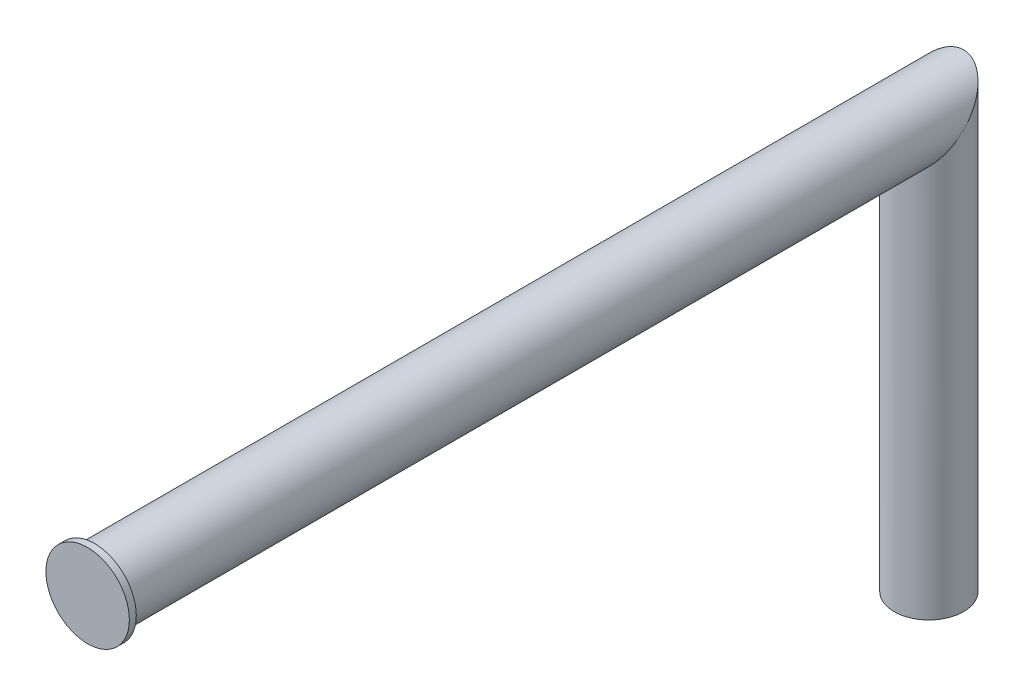
ISO-10303-21;
HEADER;
FILE_DESCRIPTION(('STEP AP214'),'2;1');
FILE_NAME('part.step','',(''),(''),'','','');
FILE_SCHEMA(('AUTOMOTIVE_DESIGN { 1 0 10303 214 1 1 1 1 }'));
ENDSEC;
DATA;
#1=APPLICATION_CONTEXT('core data for automotive mechanical design processes');
#2=APPLICATION_PROTOCOL_DEFINITION('international standard','automotive_design',2000,#1);
#3=PRODUCT_CONTEXT('',#1,'mechanical');
#4=PRODUCT('Part','Part','',(#3));
#5=PRODUCT_RELATED_PRODUCT_CATEGORY('part','',(#4));
#6=PRODUCT_DEFINITION_FORMATION('','',#4);
#7=PRODUCT_DEFINITION_CONTEXT('part definition',#1,'design');
#8=PRODUCT_DEFINITION('design','',#6,#7);
#9=PRODUCT_DEFINITION_SHAPE('','',#8);
#10=(LENGTH_UNIT() NAMED_UNIT(*) SI_UNIT(.MILLI.,.METRE.));
#11=(NAMED_UNIT(*) PLANE_ANGLE_UNIT() SI_UNIT($,.RADIAN.));
#12=(NAMED_UNIT(*) SI_UNIT($,.STERADIAN.) SOLID_ANGLE_UNIT());
#13=UNCERTAINTY_MEASURE_WITH_UNIT(LENGTH_MEASURE(1.E-05),#10,'distance_accuracy_value','');
#14=(GEOMETRIC_REPRESENTATION_CONTEXT(3) GLOBAL_UNCERTAINTY_ASSIGNED_CONTEXT((#13)) GLOBAL_UNIT_ASSIGNED_CONTEXT((#10,
#11,#12)) REPRESENTATION_CONTEXT('',''));
#15=CARTESIAN_POINT('',(0.,0.,0.));
#16=DIRECTION('',(0.,0.,1.));
#17=DIRECTION('',(1.,0.,0.));
#18=AXIS2_PLACEMENT_3D('',#15,#16,#17);
#19=CARTESIAN_POINT('',(0.,0.,-25.4));
#20=DIRECTION('',(0.,0.,1.));
#21=DIRECTION('',(1.,0.,0.));
#22=AXIS2_PLACEMENT_3D('',#19,#20,#21);
#23=CYLINDRICAL_SURFACE('',#22,15.24);
#24=CARTESIAN_POINT('',(0.,0.,-25.4));
#25=DIRECTION('',(0.,0.,1.));
#26=DIRECTION('',(1.,0.,0.));
#27=AXIS2_PLACEMENT_3D('',#24,#25,#26);
#28=CIRCLE('',#27,15.24);
#29=CARTESIAN_POINT('',(15.24,0.,-25.4));
#30=VERTEX_POINT('',#29);
#31=EDGE_CURVE('E46',#30,#30,#28,.T.);
#32=ORIENTED_EDGE('',*,*,#31,.T.);
#33=EDGE_LOOP('',(#32));
#34=FACE_BOUND('',#33,.T.);
#35=CARTESIAN_POINT('',(0.,0.,-22.86));
#36=DIRECTION('',(0.,0.,1.));
#37=DIRECTION('',(1.,0.,0.));
#38=AXIS2_PLACEMENT_3D('',#35,#36,#37);
#39=CIRCLE('',#38,15.24);
#40=CARTESIAN_POINT('',(15.24,0.,-22.86));
#41=VERTEX_POINT('',#40);
#42=EDGE_CURVE('E49',#41,#41,#39,.T.);
#43=ORIENTED_EDGE('',*,*,#42,.F.);
#44=EDGE_LOOP('',(#43));
#45=FACE_BOUND('',#44,.T.);
#46=ADVANCED_FACE('F32',(#34,#45),#23,.T.);
#47=CARTESIAN_POINT('',(0.,0.,-366.121024484277));
#48=DIRECTION('',(0.,0.,1.));
#49=DIRECTION('',(1.,0.,0.));
#50=AXIS2_PLACEMENT_3D('',#47,#48,#49);
#51=CYLINDRICAL_SURFACE('',#50,12.7);
#52=CARTESIAN_POINT('',(0.,0.,-330.2));
#53=DIRECTION('',(0.,-0.707106781186548,-0.707106781186548));
#54=DIRECTION('',(0.,-0.707106781186548,0.707106781186548));
#55=AXIS2_PLACEMENT_3D('',#52,#53,#54);
#56=ELLIPSE('',#55,17.9605122421383,12.7);
#57=CARTESIAN_POINT('',(0.,-12.7,-317.5));
#58=VERTEX_POINT('',#57);
#59=EDGE_CURVE('E40',#58,#58,#56,.F.);
#60=ORIENTED_EDGE('',*,*,#59,.T.);
#61=EDGE_LOOP('',(#60));
#62=FACE_BOUND('',#61,.T.);
#63=CARTESIAN_POINT('',(0.,0.,-25.4));
#64=DIRECTION('',(0.,0.,1.));
#65=DIRECTION('',(1.,0.,0.));
#66=AXIS2_PLACEMENT_3D('',#63,#64,#65);
#67=CIRCLE('',#66,12.7);
#68=CARTESIAN_POINT('',(12.7,0.,-25.4));
#69=VERTEX_POINT('',#68);
#70=EDGE_CURVE('E36',#69,#69,#67,.F.);
#71=ORIENTED_EDGE('',*,*,#70,.T.);
#72=EDGE_LOOP('',(#71));
#73=FACE_BOUND('',#72,.T.);
#74=ADVANCED_FACE('F56',(#62,#73),#51,.T.);
#75=CARTESIAN_POINT('',(0.,0.,-330.2));
#76=DIRECTION('',(0.,-1.,0.));
#77=DIRECTION('',(0.,0.,-1.));
#78=AXIS2_PLACEMENT_3D('',#75,#76,#77);
#79=CYLINDRICAL_SURFACE('',#78,12.7);
#80=ORIENTED_EDGE('',*,*,#59,.F.);
#81=EDGE_LOOP('',(#80));
#82=FACE_BOUND('',#81,.T.);
#83=CARTESIAN_POINT('',(0.,-152.4,-330.2));
#84=DIRECTION('',(0.,-1.,0.));
#85=DIRECTION('',(0.,0.,-1.));
#86=AXIS2_PLACEMENT_3D('',#83,#84,#85);
#87=CIRCLE('',#86,12.7);
#88=CARTESIAN_POINT('',(0.,-152.4,-342.9));
#89=VERTEX_POINT('',#88);
#90=EDGE_CURVE('E11',#89,#89,#87,.T.);
#91=ORIENTED_EDGE('',*,*,#90,.F.);
#92=EDGE_LOOP('',(#91));
#93=FACE_BOUND('',#92,.T.);
#94=ADVANCED_FACE('F34',(#82,#93),#79,.T.);
#95=CARTESIAN_POINT('',(0.,-152.4,-330.2));
#96=DIRECTION('',(0.,-1.,0.));
#97=DIRECTION('',(0.,0.,-1.));
#98=AXIS2_PLACEMENT_3D('',#95,#96,#97);
#99=PLANE('',#98);
#100=ORIENTED_EDGE('',*,*,#90,.T.);
#101=EDGE_LOOP('',(#100));
#102=FACE_BOUND('',#101,.T.);
#103=ADVANCED_FACE('F67',(#102),#99,.T.);
#104=CARTESIAN_POINT('',(0.,0.,-25.4));
#105=DIRECTION('',(0.,0.,1.));
#106=DIRECTION('',(1.,0.,0.));
#107=AXIS2_PLACEMENT_3D('',#104,#105,#106);
#108=PLANE('',#107);
#109=ORIENTED_EDGE('',*,*,#70,.F.);
#110=EDGE_LOOP('',(#109));
#111=FACE_BOUND('',#110,.T.);
#112=ORIENTED_EDGE('',*,*,#31,.F.);
#113=EDGE_LOOP('',(#112));
#114=FACE_BOUND('',#113,.T.);
#115=ADVANCED_FACE('F65',(#111,#114),#108,.F.);
#116=CARTESIAN_POINT('',(0.,0.,-22.86));
#117=DIRECTION('',(0.,0.,1.));
#118=DIRECTION('',(1.,0.,0.));
#119=AXIS2_PLACEMENT_3D('',#116,#117,#118);
#120=PLANE('',#119);
#121=ORIENTED_EDGE('',*,*,#42,.T.);
#122=EDGE_LOOP('',(#121));
#123=FACE_BOUND('',#122,.T.);
#124=ADVANCED_FACE('F53',(#123),#120,.T.);
#125=CLOSED_SHELL('',(#46,#74,#94,#103,#115,#124));
#126=MANIFOLD_SOLID_BREP('B2',#125);
#127=ADVANCED_BREP_SHAPE_REPRESENTATION('',(#18,#126),#14);
#128=SHAPE_DEFINITION_REPRESENTATION(#9,#127);
ENDSEC;
END-ISO-10303-21;
